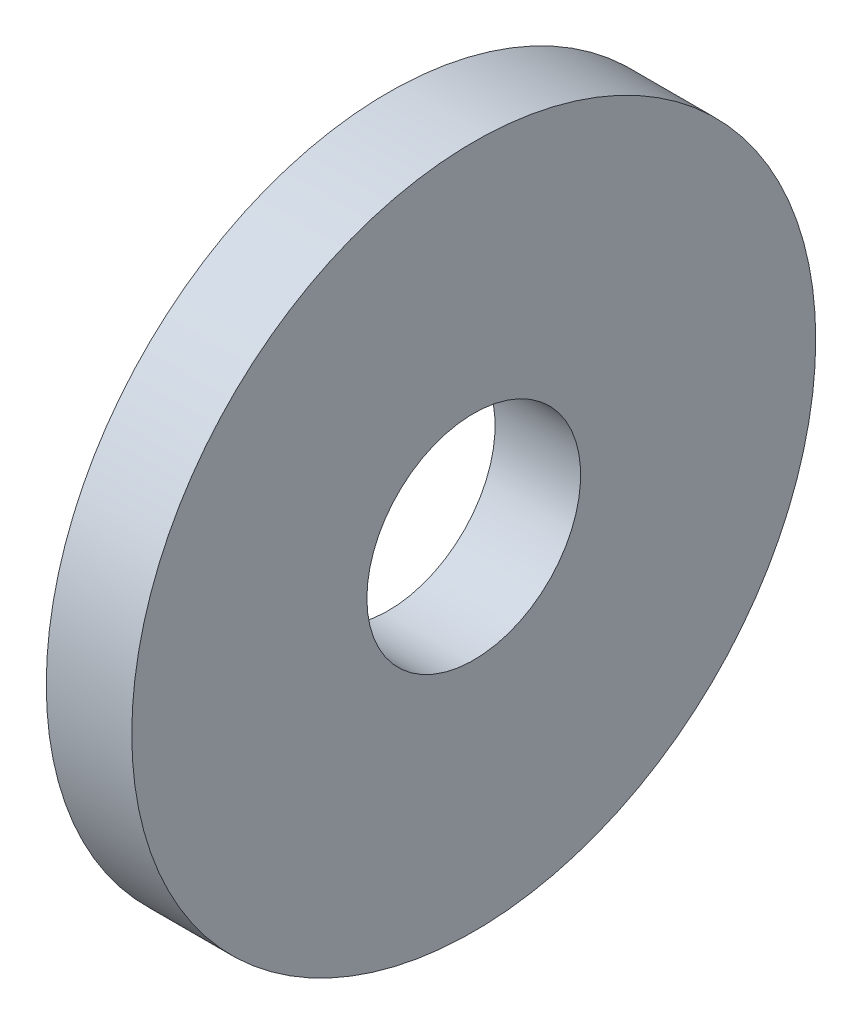
ISO-10303-21;
HEADER;
FILE_DESCRIPTION(('STEP AP214'),'2;1');
FILE_NAME('part.step','',(''),(''),'','','');
FILE_SCHEMA(('AUTOMOTIVE_DESIGN { 1 0 10303 214 1 1 1 1 }'));
ENDSEC;
DATA;
#1=APPLICATION_CONTEXT('core data for automotive mechanical design processes');
#2=APPLICATION_PROTOCOL_DEFINITION('international standard','automotive_design',2000,#1);
#3=PRODUCT_CONTEXT('',#1,'mechanical');
#4=PRODUCT('Part','Part','',(#3));
#5=PRODUCT_RELATED_PRODUCT_CATEGORY('part','',(#4));
#6=PRODUCT_DEFINITION_FORMATION('','',#4);
#7=PRODUCT_DEFINITION_CONTEXT('part definition',#1,'design');
#8=PRODUCT_DEFINITION('design','',#6,#7);
#9=PRODUCT_DEFINITION_SHAPE('','',#8);
#10=(LENGTH_UNIT() NAMED_UNIT(*) SI_UNIT(.MILLI.,.METRE.));
#11=(NAMED_UNIT(*) PLANE_ANGLE_UNIT() SI_UNIT($,.RADIAN.));
#12=(NAMED_UNIT(*) SI_UNIT($,.STERADIAN.) SOLID_ANGLE_UNIT());
#13=UNCERTAINTY_MEASURE_WITH_UNIT(LENGTH_MEASURE(1.E-05),#10,'distance_accuracy_value','');
#14=(GEOMETRIC_REPRESENTATION_CONTEXT(3) GLOBAL_UNCERTAINTY_ASSIGNED_CONTEXT((#13)) GLOBAL_UNIT_ASSIGNED_CONTEXT((#10,
#11,#12)) REPRESENTATION_CONTEXT('',''));
#15=CARTESIAN_POINT('',(0.,0.,0.));
#16=DIRECTION('',(0.,0.,1.));
#17=DIRECTION('',(1.,0.,0.));
#18=AXIS2_PLACEMENT_3D('',#15,#16,#17);
#19=CARTESIAN_POINT('',(77.7999999999986,713.260912286228,-421.857743681072));
#20=DIRECTION('',(1.,0.,0.));
#21=DIRECTION('',(0.,0.,-1.));
#22=AXIS2_PLACEMENT_3D('',#19,#20,#21);
#23=PLANE('',#22);
#24=CARTESIAN_POINT('',(77.7999999999986,709.260912286228,-417.857743681072));
#25=DIRECTION('',(-1.,0.,0.));
#26=DIRECTION('',(0.,0.,1.));
#27=AXIS2_PLACEMENT_3D('',#24,#25,#26);
#28=CIRCLE('',#27,1.25000000000002);
#29=CARTESIAN_POINT('',(77.7999999999986,709.260912286228,-416.607743681072));
#30=VERTEX_POINT('',#29);
#31=EDGE_CURVE('E27',#30,#30,#28,.T.);
#32=ORIENTED_EDGE('',*,*,#31,.T.);
#33=EDGE_LOOP('',(#32));
#34=FACE_BOUND('',#33,.T.);
#35=CARTESIAN_POINT('',(77.7999999999986,709.260912286228,-417.857743681072));
#36=DIRECTION('',(-1.,0.,0.));
#37=DIRECTION('',(0.,0.,1.));
#38=AXIS2_PLACEMENT_3D('',#35,#36,#37);
#39=CIRCLE('',#38,3.99999999999998);
#40=CARTESIAN_POINT('',(77.7999999999986,709.260912286228,-413.857743681072));
#41=VERTEX_POINT('',#40);
#42=EDGE_CURVE('E18',#41,#41,#39,.T.);
#43=ORIENTED_EDGE('',*,*,#42,.F.);
#44=EDGE_LOOP('',(#43));
#45=FACE_BOUND('',#44,.T.);
#46=ADVANCED_FACE('F15',(#34,#45),#23,.T.);
#47=CARTESIAN_POINT('',(77.7999999999986,709.260912286228,-417.857743681072));
#48=DIRECTION('',(-1.,0.,0.));
#49=DIRECTION('',(0.,0.,1.));
#50=AXIS2_PLACEMENT_3D('',#47,#48,#49);
#51=CYLINDRICAL_SURFACE('',#50,3.99999999999998);
#52=ORIENTED_EDGE('',*,*,#42,.T.);
#53=EDGE_LOOP('',(#52));
#54=FACE_BOUND('',#53,.T.);
#55=CARTESIAN_POINT('',(76.7999999999986,709.260912286228,-417.857743681072));
#56=DIRECTION('',(-1.,0.,0.));
#57=DIRECTION('',(0.,0.,1.));
#58=AXIS2_PLACEMENT_3D('',#55,#56,#57);
#59=CIRCLE('',#58,3.99999999999998);
#60=CARTESIAN_POINT('',(76.7999999999986,709.260912286228,-413.857743681072));
#61=VERTEX_POINT('',#60);
#62=EDGE_CURVE('E22',#61,#61,#59,.T.);
#63=ORIENTED_EDGE('',*,*,#62,.F.);
#64=EDGE_LOOP('',(#63));
#65=FACE_BOUND('',#64,.T.);
#66=ADVANCED_FACE('F35',(#54,#65),#51,.T.);
#67=CARTESIAN_POINT('',(77.7999999999986,709.260912286228,-417.857743681072));
#68=DIRECTION('',(-1.,0.,0.));
#69=DIRECTION('',(0.,0.,1.));
#70=AXIS2_PLACEMENT_3D('',#67,#68,#69);
#71=CYLINDRICAL_SURFACE('',#70,1.25000000000002);
#72=CARTESIAN_POINT('',(76.7999999999986,709.260912286228,-417.857743681072));
#73=DIRECTION('',(-1.,0.,0.));
#74=DIRECTION('',(0.,0.,1.));
#75=AXIS2_PLACEMENT_3D('',#72,#73,#74);
#76=CIRCLE('',#75,1.25000000000002);
#77=CARTESIAN_POINT('',(76.7999999999986,709.260912286228,-416.607743681072));
#78=VERTEX_POINT('',#77);
#79=EDGE_CURVE('E10',#78,#78,#76,.F.);
#80=ORIENTED_EDGE('',*,*,#79,.F.);
#81=EDGE_LOOP('',(#80));
#82=FACE_BOUND('',#81,.T.);
#83=ORIENTED_EDGE('',*,*,#31,.F.);
#84=EDGE_LOOP('',(#83));
#85=FACE_BOUND('',#84,.T.);
#86=ADVANCED_FACE('F43',(#82,#85),#71,.F.);
#87=CARTESIAN_POINT('',(76.7999999999986,713.260912286228,-413.857743681072));
#88=DIRECTION('',(-1.,0.,0.));
#89=DIRECTION('',(0.,0.,1.));
#90=AXIS2_PLACEMENT_3D('',#87,#88,#89);
#91=PLANE('',#90);
#92=ORIENTED_EDGE('',*,*,#79,.T.);
#93=EDGE_LOOP('',(#92));
#94=FACE_BOUND('',#93,.T.);
#95=ORIENTED_EDGE('',*,*,#62,.T.);
#96=EDGE_LOOP('',(#95));
#97=FACE_BOUND('',#96,.T.);
#98=ADVANCED_FACE('F44',(#94,#97),#91,.T.);
#99=CLOSED_SHELL('',(#46,#66,#86,#98));
#100=MANIFOLD_SOLID_BREP('B1',#99);
#101=ADVANCED_BREP_SHAPE_REPRESENTATION('',(#18,#100),#14);
#102=SHAPE_DEFINITION_REPRESENTATION(#9,#101);
ENDSEC;
END-ISO-10303-21;
